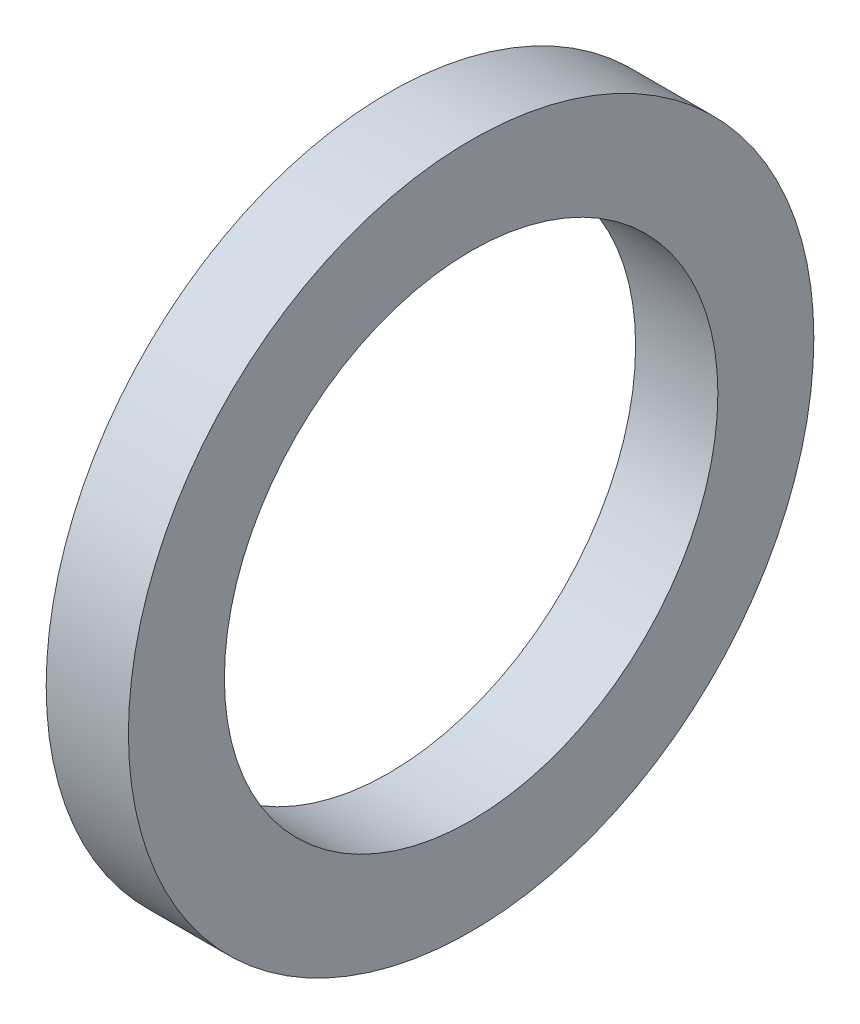
ISO-10303-21;
HEADER;
FILE_DESCRIPTION(('STEP AP214'),'2;1');
FILE_NAME('part.step','',(''),(''),'','','');
FILE_SCHEMA(('AUTOMOTIVE_DESIGN { 1 0 10303 214 1 1 1 1 }'));
ENDSEC;
DATA;
#1=APPLICATION_CONTEXT('core data for automotive mechanical design processes');
#2=APPLICATION_PROTOCOL_DEFINITION('international standard','automotive_design',2000,#1);
#3=PRODUCT_CONTEXT('',#1,'mechanical');
#4=PRODUCT('Part','Part','',(#3));
#5=PRODUCT_RELATED_PRODUCT_CATEGORY('part','',(#4));
#6=PRODUCT_DEFINITION_FORMATION('','',#4);
#7=PRODUCT_DEFINITION_CONTEXT('part definition',#1,'design');
#8=PRODUCT_DEFINITION('design','',#6,#7);
#9=PRODUCT_DEFINITION_SHAPE('','',#8);
#10=(LENGTH_UNIT() NAMED_UNIT(*) SI_UNIT(.MILLI.,.METRE.));
#11=(NAMED_UNIT(*) PLANE_ANGLE_UNIT() SI_UNIT($,.RADIAN.));
#12=(NAMED_UNIT(*) SI_UNIT($,.STERADIAN.) SOLID_ANGLE_UNIT());
#13=UNCERTAINTY_MEASURE_WITH_UNIT(LENGTH_MEASURE(1.E-05),#10,'distance_accuracy_value','');
#14=(GEOMETRIC_REPRESENTATION_CONTEXT(3) GLOBAL_UNCERTAINTY_ASSIGNED_CONTEXT((#13)) GLOBAL_UNIT_ASSIGNED_CONTEXT((#10,
#11,#12)) REPRESENTATION_CONTEXT('',''));
#15=CARTESIAN_POINT('',(0.,0.,0.));
#16=DIRECTION('',(0.,0.,1.));
#17=DIRECTION('',(1.,0.,0.));
#18=AXIS2_PLACEMENT_3D('',#15,#16,#17);
#19=CARTESIAN_POINT('',(-34.9249999999999,0.,0.));
#20=DIRECTION('',(-1.,0.,0.));
#21=DIRECTION('',(0.,0.,1.));
#22=AXIS2_PLACEMENT_3D('',#19,#20,#21);
#23=CYLINDRICAL_SURFACE('',#22,18.);
#24=CARTESIAN_POINT('',(0.,0.,0.));
#25=DIRECTION('',(-1.,0.,0.));
#26=DIRECTION('',(0.,0.,1.));
#27=AXIS2_PLACEMENT_3D('',#24,#25,#26);
#28=CIRCLE('',#27,18.);
#29=CARTESIAN_POINT('',(0.,0.,18.));
#30=VERTEX_POINT('',#29);
#31=EDGE_CURVE('E10',#30,#30,#28,.T.);
#32=ORIENTED_EDGE('',*,*,#31,.F.);
#33=EDGE_LOOP('',(#32));
#34=FACE_BOUND('',#33,.T.);
#35=CARTESIAN_POINT('',(-6.,0.,0.));
#36=DIRECTION('',(-1.,0.,0.));
#37=DIRECTION('',(0.,0.,1.));
#38=AXIS2_PLACEMENT_3D('',#35,#36,#37);
#39=CIRCLE('',#38,18.);
#40=CARTESIAN_POINT('',(-6.,0.,18.));
#41=VERTEX_POINT('',#40);
#42=EDGE_CURVE('E49',#41,#41,#39,.T.);
#43=ORIENTED_EDGE('',*,*,#42,.T.);
#44=EDGE_LOOP('',(#43));
#45=FACE_BOUND('',#44,.T.);
#46=ADVANCED_FACE('F38',(#34,#45),#23,.F.);
#47=CARTESIAN_POINT('',(0.,18.,0.));
#48=DIRECTION('',(-1.,0.,0.));
#49=DIRECTION('',(0.,0.,1.));
#50=AXIS2_PLACEMENT_3D('',#47,#48,#49);
#51=PLANE('',#50);
#52=CARTESIAN_POINT('',(0.,0.,0.));
#53=DIRECTION('',(-1.,0.,0.));
#54=DIRECTION('',(0.,0.,1.));
#55=AXIS2_PLACEMENT_3D('',#52,#53,#54);
#56=CIRCLE('',#55,25.);
#57=CARTESIAN_POINT('',(0.,0.,25.));
#58=VERTEX_POINT('',#57);
#59=EDGE_CURVE('E45',#58,#58,#56,.T.);
#60=ORIENTED_EDGE('',*,*,#59,.F.);
#61=EDGE_LOOP('',(#60));
#62=FACE_BOUND('',#61,.T.);
#63=ORIENTED_EDGE('',*,*,#31,.T.);
#64=EDGE_LOOP('',(#63));
#65=FACE_BOUND('',#64,.T.);
#66=ADVANCED_FACE('F63',(#62,#65),#51,.F.);
#67=CARTESIAN_POINT('',(-34.9249999999999,0.,0.));
#68=DIRECTION('',(-1.,0.,0.));
#69=DIRECTION('',(0.,0.,1.));
#70=AXIS2_PLACEMENT_3D('',#67,#68,#69);
#71=CYLINDRICAL_SURFACE('',#70,25.);
#72=CARTESIAN_POINT('',(-6.,0.,0.));
#73=DIRECTION('',(-1.,0.,0.));
#74=DIRECTION('',(0.,0.,1.));
#75=AXIS2_PLACEMENT_3D('',#72,#73,#74);
#76=CIRCLE('',#75,25.);
#77=CARTESIAN_POINT('',(-6.,0.,25.));
#78=VERTEX_POINT('',#77);
#79=EDGE_CURVE('E46',#78,#78,#76,.T.);
#80=ORIENTED_EDGE('',*,*,#79,.F.);
#81=EDGE_LOOP('',(#80));
#82=FACE_BOUND('',#81,.T.);
#83=ORIENTED_EDGE('',*,*,#59,.T.);
#84=EDGE_LOOP('',(#83));
#85=FACE_BOUND('',#84,.T.);
#86=ADVANCED_FACE('F58',(#82,#85),#71,.T.);
#87=CARTESIAN_POINT('',(-6.,25.,0.));
#88=DIRECTION('',(1.,0.,0.));
#89=DIRECTION('',(0.,0.,-1.));
#90=AXIS2_PLACEMENT_3D('',#87,#88,#89);
#91=PLANE('',#90);
#92=ORIENTED_EDGE('',*,*,#42,.F.);
#93=EDGE_LOOP('',(#92));
#94=FACE_BOUND('',#93,.T.);
#95=ORIENTED_EDGE('',*,*,#79,.T.);
#96=EDGE_LOOP('',(#95));
#97=FACE_BOUND('',#96,.T.);
#98=ADVANCED_FACE('F60',(#94,#97),#91,.F.);
#99=CLOSED_SHELL('',(#46,#66,#86,#98));
#100=MANIFOLD_SOLID_BREP('B2',#99);
#101=ADVANCED_BREP_SHAPE_REPRESENTATION('',(#18,#100),#14);
#102=SHAPE_DEFINITION_REPRESENTATION(#9,#101);
ENDSEC;
END-ISO-10303-21;
